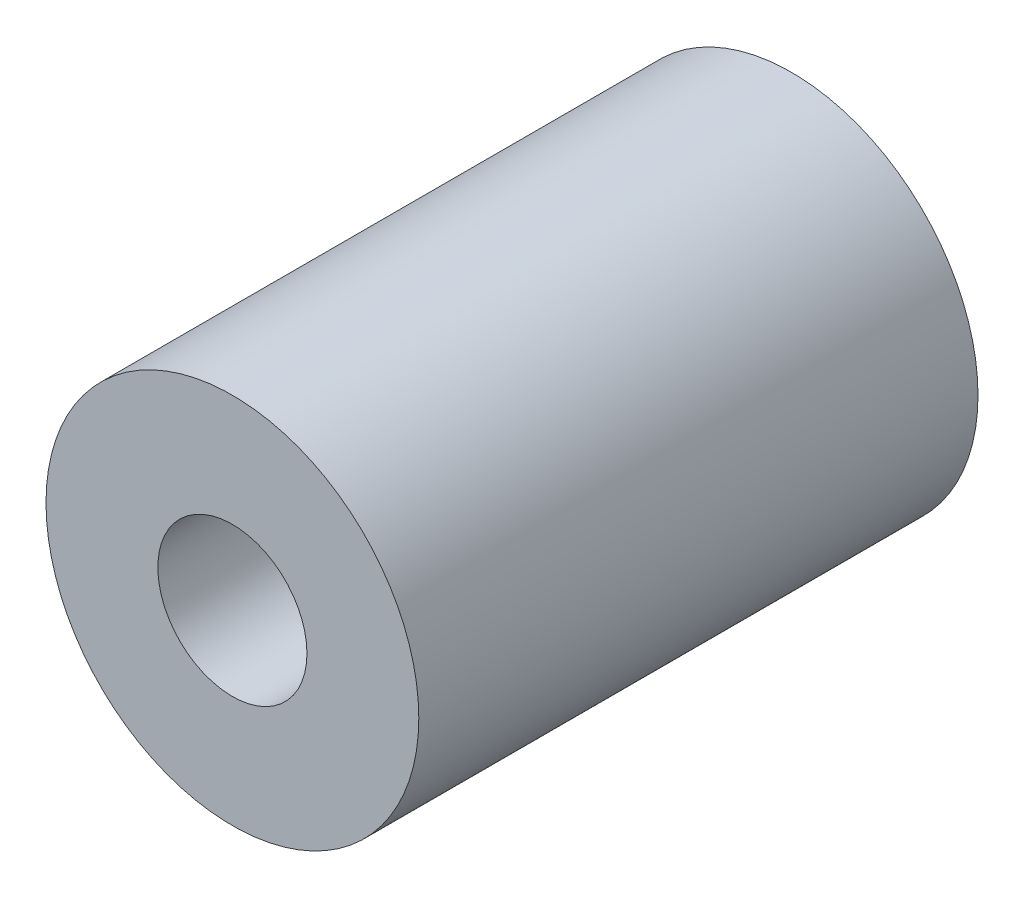
ISO-10303-21;
HEADER;
FILE_DESCRIPTION(('STEP AP214'),'2;1');
FILE_NAME('part.step','',(''),(''),'','','');
FILE_SCHEMA(('AUTOMOTIVE_DESIGN { 1 0 10303 214 1 1 1 1 }'));
ENDSEC;
DATA;
#1=APPLICATION_CONTEXT('core data for automotive mechanical design processes');
#2=APPLICATION_PROTOCOL_DEFINITION('international standard','automotive_design',2000,#1);
#3=PRODUCT_CONTEXT('',#1,'mechanical');
#4=PRODUCT('Part','Part','',(#3));
#5=PRODUCT_RELATED_PRODUCT_CATEGORY('part','',(#4));
#6=PRODUCT_DEFINITION_FORMATION('','',#4);
#7=PRODUCT_DEFINITION_CONTEXT('part definition',#1,'design');
#8=PRODUCT_DEFINITION('design','',#6,#7);
#9=PRODUCT_DEFINITION_SHAPE('','',#8);
#10=(LENGTH_UNIT() NAMED_UNIT(*) SI_UNIT(.MILLI.,.METRE.));
#11=(NAMED_UNIT(*) PLANE_ANGLE_UNIT() SI_UNIT($,.RADIAN.));
#12=(NAMED_UNIT(*) SI_UNIT($,.STERADIAN.) SOLID_ANGLE_UNIT());
#13=UNCERTAINTY_MEASURE_WITH_UNIT(LENGTH_MEASURE(1.E-05),#10,'distance_accuracy_value','');
#14=(GEOMETRIC_REPRESENTATION_CONTEXT(3) GLOBAL_UNCERTAINTY_ASSIGNED_CONTEXT((#13)) GLOBAL_UNIT_ASSIGNED_CONTEXT((#10,
#11,#12)) REPRESENTATION_CONTEXT('',''));
#15=CARTESIAN_POINT('',(0.,0.,0.));
#16=DIRECTION('',(0.,0.,1.));
#17=DIRECTION('',(1.,0.,0.));
#18=AXIS2_PLACEMENT_3D('',#15,#16,#17);
#19=CARTESIAN_POINT('',(0.,0.,12.));
#20=DIRECTION('',(0.,0.,1.));
#21=DIRECTION('',(1.,0.,0.));
#22=AXIS2_PLACEMENT_3D('',#19,#20,#21);
#23=PLANE('',#22);
#24=CARTESIAN_POINT('',(0.,0.,12.));
#25=DIRECTION('',(0.,0.,1.));
#26=DIRECTION('',(1.,0.,0.));
#27=AXIS2_PLACEMENT_3D('',#24,#25,#26);
#28=CIRCLE('',#27,4.);
#29=CARTESIAN_POINT('',(4.,0.,12.));
#30=VERTEX_POINT('',#29);
#31=EDGE_CURVE('E10',#30,#30,#28,.T.);
#32=ORIENTED_EDGE('',*,*,#31,.T.);
#33=EDGE_LOOP('',(#32));
#34=FACE_BOUND('',#33,.T.);
#35=CARTESIAN_POINT('',(0.,0.,12.));
#36=DIRECTION('',(0.,0.,1.));
#37=DIRECTION('',(1.,0.,0.));
#38=AXIS2_PLACEMENT_3D('',#35,#36,#37);
#39=CIRCLE('',#38,1.6);
#40=CARTESIAN_POINT('',(1.6,0.,12.));
#41=VERTEX_POINT('',#40);
#42=EDGE_CURVE('E44',#41,#41,#39,.T.);
#43=ORIENTED_EDGE('',*,*,#42,.F.);
#44=EDGE_LOOP('',(#43));
#45=FACE_BOUND('',#44,.T.);
#46=ADVANCED_FACE('F33',(#34,#45),#23,.T.);
#47=CARTESIAN_POINT('',(0.,0.,0.));
#48=DIRECTION('',(0.,0.,1.));
#49=DIRECTION('',(1.,0.,0.));
#50=AXIS2_PLACEMENT_3D('',#47,#48,#49);
#51=PLANE('',#50);
#52=CARTESIAN_POINT('',(0.,0.,0.));
#53=DIRECTION('',(0.,0.,1.));
#54=DIRECTION('',(1.,0.,0.));
#55=AXIS2_PLACEMENT_3D('',#52,#53,#54);
#56=CIRCLE('',#55,4.);
#57=CARTESIAN_POINT('',(4.,0.,0.));
#58=VERTEX_POINT('',#57);
#59=EDGE_CURVE('E37',#58,#58,#56,.T.);
#60=ORIENTED_EDGE('',*,*,#59,.F.);
#61=EDGE_LOOP('',(#60));
#62=FACE_BOUND('',#61,.T.);
#63=CARTESIAN_POINT('',(0.,0.,0.));
#64=DIRECTION('',(0.,0.,1.));
#65=DIRECTION('',(1.,0.,0.));
#66=AXIS2_PLACEMENT_3D('',#63,#64,#65);
#67=CIRCLE('',#66,1.6);
#68=CARTESIAN_POINT('',(1.6,0.,0.));
#69=VERTEX_POINT('',#68);
#70=EDGE_CURVE('E46',#69,#69,#67,.T.);
#71=ORIENTED_EDGE('',*,*,#70,.T.);
#72=EDGE_LOOP('',(#71));
#73=FACE_BOUND('',#72,.T.);
#74=ADVANCED_FACE('F56',(#62,#73),#51,.F.);
#75=CARTESIAN_POINT('',(0.,0.,12.));
#76=DIRECTION('',(0.,0.,-1.));
#77=DIRECTION('',(-1.,0.,0.));
#78=AXIS2_PLACEMENT_3D('',#75,#76,#77);
#79=CYLINDRICAL_SURFACE('',#78,4.);
#80=ORIENTED_EDGE('',*,*,#31,.F.);
#81=EDGE_LOOP('',(#80));
#82=FACE_BOUND('',#81,.T.);
#83=ORIENTED_EDGE('',*,*,#59,.T.);
#84=EDGE_LOOP('',(#83));
#85=FACE_BOUND('',#84,.T.);
#86=ADVANCED_FACE('F35',(#82,#85),#79,.T.);
#87=CARTESIAN_POINT('',(0.,0.,12.));
#88=DIRECTION('',(0.,0.,-1.));
#89=DIRECTION('',(-1.,0.,0.));
#90=AXIS2_PLACEMENT_3D('',#87,#88,#89);
#91=CYLINDRICAL_SURFACE('',#90,1.6);
#92=ORIENTED_EDGE('',*,*,#42,.T.);
#93=EDGE_LOOP('',(#92));
#94=FACE_BOUND('',#93,.T.);
#95=ORIENTED_EDGE('',*,*,#70,.F.);
#96=EDGE_LOOP('',(#95));
#97=FACE_BOUND('',#96,.T.);
#98=ADVANCED_FACE('F52',(#94,#97),#91,.F.);
#99=CLOSED_SHELL('',(#46,#74,#86,#98));
#100=MANIFOLD_SOLID_BREP('B2',#99);
#101=ADVANCED_BREP_SHAPE_REPRESENTATION('',(#18,#100),#14);
#102=SHAPE_DEFINITION_REPRESENTATION(#9,#101);
ENDSEC;
END-ISO-10303-21;
